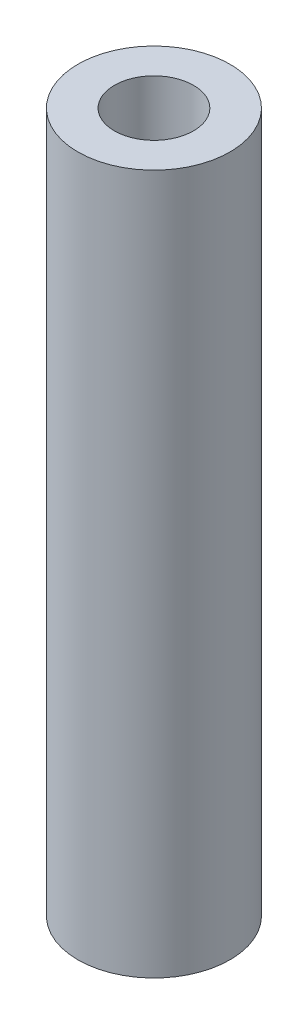
ISO-10303-21;
HEADER;
FILE_DESCRIPTION(('STEP AP214'),'2;1');
FILE_NAME('part.step','',(''),(''),'','','');
FILE_SCHEMA(('AUTOMOTIVE_DESIGN { 1 0 10303 214 1 1 1 1 }'));
ENDSEC;
DATA;
#1=APPLICATION_CONTEXT('core data for automotive mechanical design processes');
#2=APPLICATION_PROTOCOL_DEFINITION('international standard','automotive_design',2000,#1);
#3=PRODUCT_CONTEXT('',#1,'mechanical');
#4=PRODUCT('Part','Part','',(#3));
#5=PRODUCT_RELATED_PRODUCT_CATEGORY('part','',(#4));
#6=PRODUCT_DEFINITION_FORMATION('','',#4);
#7=PRODUCT_DEFINITION_CONTEXT('part definition',#1,'design');
#8=PRODUCT_DEFINITION('design','',#6,#7);
#9=PRODUCT_DEFINITION_SHAPE('','',#8);
#10=(LENGTH_UNIT() NAMED_UNIT(*) SI_UNIT(.MILLI.,.METRE.));
#11=(NAMED_UNIT(*) PLANE_ANGLE_UNIT() SI_UNIT($,.RADIAN.));
#12=(NAMED_UNIT(*) SI_UNIT($,.STERADIAN.) SOLID_ANGLE_UNIT());
#13=UNCERTAINTY_MEASURE_WITH_UNIT(LENGTH_MEASURE(1.E-05),#10,'distance_accuracy_value','');
#14=(GEOMETRIC_REPRESENTATION_CONTEXT(3) GLOBAL_UNCERTAINTY_ASSIGNED_CONTEXT((#13)) GLOBAL_UNIT_ASSIGNED_CONTEXT((#10,
#11,#12)) REPRESENTATION_CONTEXT('',''));
#15=CARTESIAN_POINT('',(0.,0.,0.));
#16=DIRECTION('',(0.,0.,1.));
#17=DIRECTION('',(1.,0.,0.));
#18=AXIS2_PLACEMENT_3D('',#15,#16,#17);
#19=CARTESIAN_POINT('',(0.,46.,0.));
#20=DIRECTION('',(0.,1.,0.));
#21=DIRECTION('',(0.,0.,1.));
#22=AXIS2_PLACEMENT_3D('',#19,#20,#21);
#23=PLANE('',#22);
#24=CARTESIAN_POINT('',(0.,46.,0.));
#25=DIRECTION('',(0.,1.,0.));
#26=DIRECTION('',(0.,0.,1.));
#27=AXIS2_PLACEMENT_3D('',#24,#25,#26);
#28=CIRCLE('',#27,5.);
#29=CARTESIAN_POINT('',(0.,46.,5.));
#30=VERTEX_POINT('',#29);
#31=EDGE_CURVE('E10',#30,#30,#28,.T.);
#32=ORIENTED_EDGE('',*,*,#31,.T.);
#33=EDGE_LOOP('',(#32));
#34=FACE_BOUND('',#33,.T.);
#35=CARTESIAN_POINT('',(0.,46.,0.));
#36=DIRECTION('',(0.,1.,0.));
#37=DIRECTION('',(0.,0.,1.));
#38=AXIS2_PLACEMENT_3D('',#35,#36,#37);
#39=CIRCLE('',#38,2.6);
#40=CARTESIAN_POINT('',(0.,46.,2.6));
#41=VERTEX_POINT('',#40);
#42=EDGE_CURVE('E54',#41,#41,#39,.T.);
#43=ORIENTED_EDGE('',*,*,#42,.F.);
#44=EDGE_LOOP('',(#43));
#45=FACE_BOUND('',#44,.T.);
#46=ADVANCED_FACE('F41',(#34,#45),#23,.T.);
#47=CARTESIAN_POINT('',(0.,0.,0.));
#48=DIRECTION('',(0.,1.,0.));
#49=DIRECTION('',(0.,0.,1.));
#50=AXIS2_PLACEMENT_3D('',#47,#48,#49);
#51=PLANE('',#50);
#52=CARTESIAN_POINT('',(0.,0.,0.));
#53=DIRECTION('',(0.,1.,0.));
#54=DIRECTION('',(0.,0.,1.));
#55=AXIS2_PLACEMENT_3D('',#52,#53,#54);
#56=CIRCLE('',#55,5.);
#57=CARTESIAN_POINT('',(0.,0.,5.));
#58=VERTEX_POINT('',#57);
#59=EDGE_CURVE('E45',#58,#58,#56,.T.);
#60=ORIENTED_EDGE('',*,*,#59,.F.);
#61=EDGE_LOOP('',(#60));
#62=FACE_BOUND('',#61,.T.);
#63=CARTESIAN_POINT('',(0.,0.,0.));
#64=DIRECTION('',(0.,1.,0.));
#65=DIRECTION('',(0.,0.,1.));
#66=AXIS2_PLACEMENT_3D('',#63,#64,#65);
#67=CIRCLE('',#66,2.6);
#68=CARTESIAN_POINT('',(0.,0.,2.6));
#69=VERTEX_POINT('',#68);
#70=EDGE_CURVE('E56',#69,#69,#67,.T.);
#71=ORIENTED_EDGE('',*,*,#70,.T.);
#72=EDGE_LOOP('',(#71));
#73=FACE_BOUND('',#72,.T.);
#74=ADVANCED_FACE('F68',(#62,#73),#51,.F.);
#75=CARTESIAN_POINT('',(0.,46.,0.));
#76=DIRECTION('',(0.,-1.,0.));
#77=DIRECTION('',(0.,0.,-1.));
#78=AXIS2_PLACEMENT_3D('',#75,#76,#77);
#79=CYLINDRICAL_SURFACE('',#78,5.);
#80=ORIENTED_EDGE('',*,*,#31,.F.);
#81=EDGE_LOOP('',(#80));
#82=FACE_BOUND('',#81,.T.);
#83=ORIENTED_EDGE('',*,*,#59,.T.);
#84=EDGE_LOOP('',(#83));
#85=FACE_BOUND('',#84,.T.);
#86=ADVANCED_FACE('F43',(#82,#85),#79,.T.);
#87=CARTESIAN_POINT('',(0.,46.,0.));
#88=DIRECTION('',(0.,-1.,0.));
#89=DIRECTION('',(0.,0.,-1.));
#90=AXIS2_PLACEMENT_3D('',#87,#88,#89);
#91=CYLINDRICAL_SURFACE('',#90,2.6);
#92=ORIENTED_EDGE('',*,*,#42,.T.);
#93=EDGE_LOOP('',(#92));
#94=FACE_BOUND('',#93,.T.);
#95=ORIENTED_EDGE('',*,*,#70,.F.);
#96=EDGE_LOOP('',(#95));
#97=FACE_BOUND('',#96,.T.);
#98=ADVANCED_FACE('F64',(#94,#97),#91,.F.);
#99=CLOSED_SHELL('',(#46,#74,#86,#98));
#100=MANIFOLD_SOLID_BREP('B2',#99);
#101=ADVANCED_BREP_SHAPE_REPRESENTATION('',(#18,#100),#14);
#102=SHAPE_DEFINITION_REPRESENTATION(#9,#101);
ENDSEC;
END-ISO-10303-21;
